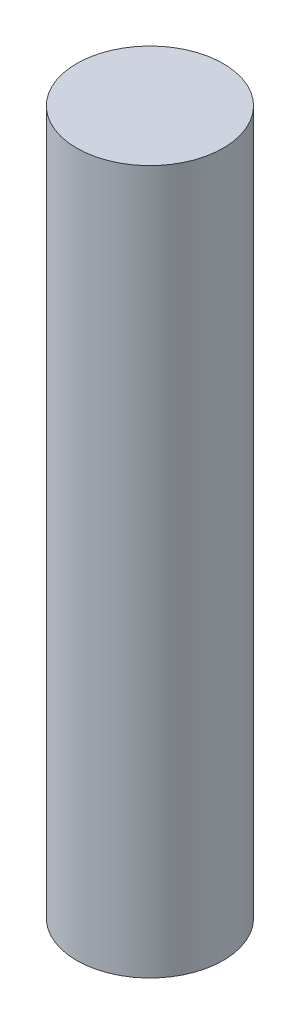
ISO-10303-21;
HEADER;
FILE_DESCRIPTION(('STEP AP214'),'2;1');
FILE_NAME('part.step','',(''),(''),'','','');
FILE_SCHEMA(('AUTOMOTIVE_DESIGN { 1 0 10303 214 1 1 1 1 }'));
ENDSEC;
DATA;
#1=APPLICATION_CONTEXT('core data for automotive mechanical design processes');
#2=APPLICATION_PROTOCOL_DEFINITION('international standard','automotive_design',2000,#1);
#3=PRODUCT_CONTEXT('',#1,'mechanical');
#4=PRODUCT('Part','Part','',(#3));
#5=PRODUCT_RELATED_PRODUCT_CATEGORY('part','',(#4));
#6=PRODUCT_DEFINITION_FORMATION('','',#4);
#7=PRODUCT_DEFINITION_CONTEXT('part definition',#1,'design');
#8=PRODUCT_DEFINITION('design','',#6,#7);
#9=PRODUCT_DEFINITION_SHAPE('','',#8);
#10=(LENGTH_UNIT() NAMED_UNIT(*) SI_UNIT(.MILLI.,.METRE.));
#11=(NAMED_UNIT(*) PLANE_ANGLE_UNIT() SI_UNIT($,.RADIAN.));
#12=(NAMED_UNIT(*) SI_UNIT($,.STERADIAN.) SOLID_ANGLE_UNIT());
#13=UNCERTAINTY_MEASURE_WITH_UNIT(LENGTH_MEASURE(1.E-05),#10,'distance_accuracy_value','');
#14=(GEOMETRIC_REPRESENTATION_CONTEXT(3) GLOBAL_UNCERTAINTY_ASSIGNED_CONTEXT((#13)) GLOBAL_UNIT_ASSIGNED_CONTEXT((#10,
#11,#12)) REPRESENTATION_CONTEXT('',''));
#15=CARTESIAN_POINT('',(0.,0.,0.));
#16=DIRECTION('',(0.,0.,1.));
#17=DIRECTION('',(1.,0.,0.));
#18=AXIS2_PLACEMENT_3D('',#15,#16,#17);
#19=CARTESIAN_POINT('',(0.,2.,0.));
#20=DIRECTION('',(0.,-1.,0.));
#21=DIRECTION('',(0.,0.,-1.));
#22=AXIS2_PLACEMENT_3D('',#19,#20,#21);
#23=CYLINDRICAL_SURFACE('',#22,2.5);
#24=CARTESIAN_POINT('',(0.,2.,0.));
#25=DIRECTION('',(0.,1.,0.));
#26=DIRECTION('',(0.,0.,1.));
#27=AXIS2_PLACEMENT_3D('',#24,#25,#26);
#28=CIRCLE('',#27,2.5);
#29=CARTESIAN_POINT('',(0.,2.,2.5));
#30=VERTEX_POINT('',#29);
#31=EDGE_CURVE('E10',#30,#30,#28,.T.);
#32=ORIENTED_EDGE('',*,*,#31,.F.);
#33=EDGE_LOOP('',(#32));
#34=FACE_BOUND('',#33,.T.);
#35=CARTESIAN_POINT('',(0.,-22.,0.));
#36=DIRECTION('',(0.,1.,0.));
#37=DIRECTION('',(0.,0.,1.));
#38=AXIS2_PLACEMENT_3D('',#35,#36,#37);
#39=CIRCLE('',#38,2.5);
#40=CARTESIAN_POINT('',(0.,-22.,2.5));
#41=VERTEX_POINT('',#40);
#42=EDGE_CURVE('E37',#41,#41,#39,.T.);
#43=ORIENTED_EDGE('',*,*,#42,.T.);
#44=EDGE_LOOP('',(#43));
#45=FACE_BOUND('',#44,.T.);
#46=ADVANCED_FACE('F31',(#34,#45),#23,.T.);
#47=CARTESIAN_POINT('',(0.,2.,0.));
#48=DIRECTION('',(0.,1.,0.));
#49=DIRECTION('',(0.,0.,1.));
#50=AXIS2_PLACEMENT_3D('',#47,#48,#49);
#51=PLANE('',#50);
#52=ORIENTED_EDGE('',*,*,#31,.T.);
#53=EDGE_LOOP('',(#52));
#54=FACE_BOUND('',#53,.T.);
#55=ADVANCED_FACE('F46',(#54),#51,.T.);
#56=CARTESIAN_POINT('',(0.,-22.,0.));
#57=DIRECTION('',(0.,1.,0.));
#58=DIRECTION('',(0.,0.,1.));
#59=AXIS2_PLACEMENT_3D('',#56,#57,#58);
#60=PLANE('',#59);
#61=ORIENTED_EDGE('',*,*,#42,.F.);
#62=EDGE_LOOP('',(#61));
#63=FACE_BOUND('',#62,.T.);
#64=ADVANCED_FACE('F44',(#63),#60,.F.);
#65=CLOSED_SHELL('',(#46,#55,#64));
#66=MANIFOLD_SOLID_BREP('B2',#65);
#67=ADVANCED_BREP_SHAPE_REPRESENTATION('',(#18,#66),#14);
#68=SHAPE_DEFINITION_REPRESENTATION(#9,#67);
ENDSEC;
END-ISO-10303-21;
